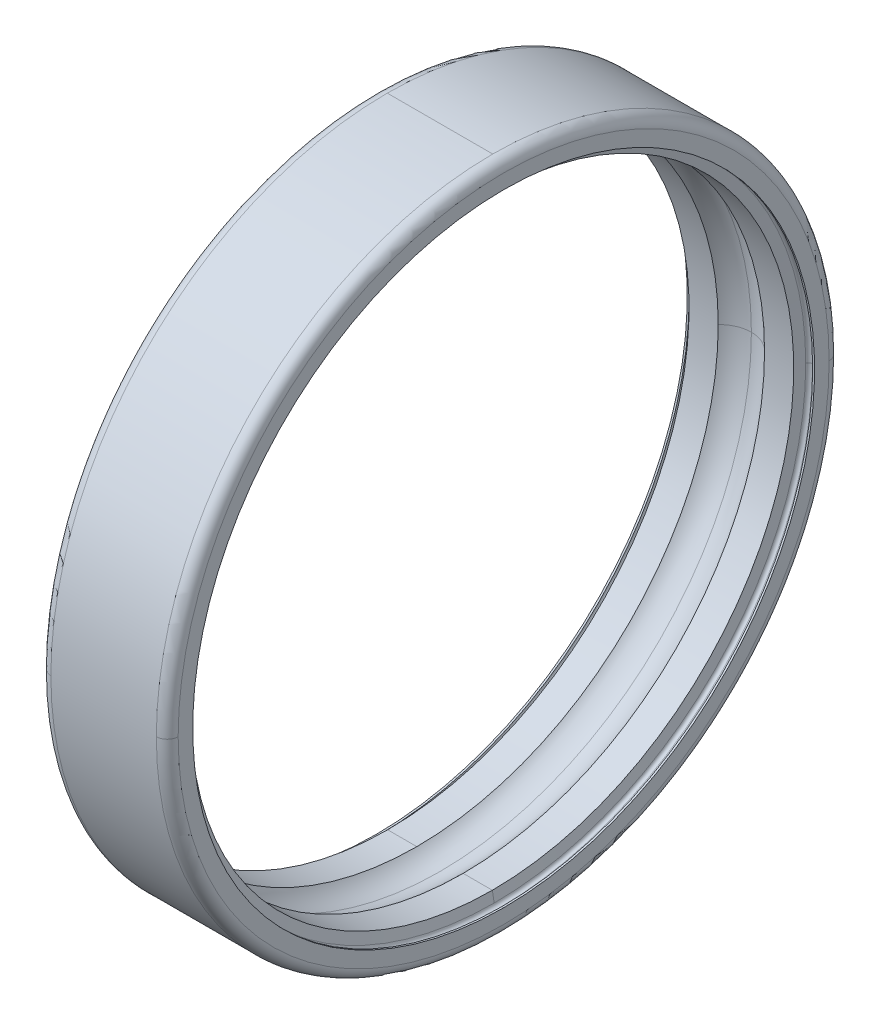
ISO-10303-21;
HEADER;
FILE_DESCRIPTION(('STEP AP214'),'2;1');
FILE_NAME('part.step','',(''),(''),'','','');
FILE_SCHEMA(('AUTOMOTIVE_DESIGN { 1 0 10303 214 1 1 1 1 }'));
ENDSEC;
DATA;
#1=APPLICATION_CONTEXT('core data for automotive mechanical design processes');
#2=APPLICATION_PROTOCOL_DEFINITION('international standard','automotive_design',2000,#1);
#3=PRODUCT_CONTEXT('',#1,'mechanical');
#4=PRODUCT('Part','Part','',(#3));
#5=PRODUCT_RELATED_PRODUCT_CATEGORY('part','',(#4));
#6=PRODUCT_DEFINITION_FORMATION('','',#4);
#7=PRODUCT_DEFINITION_CONTEXT('part definition',#1,'design');
#8=PRODUCT_DEFINITION('design','',#6,#7);
#9=PRODUCT_DEFINITION_SHAPE('','',#8);
#10=(LENGTH_UNIT() NAMED_UNIT(*) SI_UNIT(.MILLI.,.METRE.));
#11=(NAMED_UNIT(*) PLANE_ANGLE_UNIT() SI_UNIT($,.RADIAN.));
#12=(NAMED_UNIT(*) SI_UNIT($,.STERADIAN.) SOLID_ANGLE_UNIT());
#13=UNCERTAINTY_MEASURE_WITH_UNIT(LENGTH_MEASURE(1.E-05),#10,'distance_accuracy_value','');
#14=(GEOMETRIC_REPRESENTATION_CONTEXT(3) GLOBAL_UNCERTAINTY_ASSIGNED_CONTEXT((#13)) GLOBAL_UNIT_ASSIGNED_CONTEXT((#10,
#11,#12)) REPRESENTATION_CONTEXT('',''));
#15=CARTESIAN_POINT('',(0.,0.,0.));
#16=DIRECTION('',(0.,0.,1.));
#17=DIRECTION('',(1.,0.,0.));
#18=AXIS2_PLACEMENT_3D('',#15,#16,#17);
#19=CARTESIAN_POINT('',(6.685,0.,0.));
#20=DIRECTION('',(1.,0.,0.));
#21=DIRECTION('',(0.,0.,-1.));
#22=AXIS2_PLACEMENT_3D('',#19,#20,#21);
#23=TOROIDAL_SURFACE('',#22,17.1,0.21);
#24=CARTESIAN_POINT('',(6.685,0.,0.));
#25=DIRECTION('',(1.,0.,0.));
#26=DIRECTION('',(0.,0.,1.));
#27=AXIS2_PLACEMENT_3D('',#24,#25,#26);
#28=CIRCLE('',#27,17.31);
#29=CARTESIAN_POINT('',(6.685,0.,-17.31));
#30=VERTEX_POINT('',#29);
#31=CARTESIAN_POINT('',(6.685,0.,17.31));
#32=VERTEX_POINT('',#31);
#33=EDGE_CURVE('E186',#30,#32,#28,.T.);
#34=ORIENTED_EDGE('',*,*,#33,.T.);
#35=CARTESIAN_POINT('',(6.685,0.,17.1));
#36=DIRECTION('',(0.,-1.,0.));
#37=DIRECTION('',(0.,0.,1.));
#38=AXIS2_PLACEMENT_3D('',#35,#36,#37);
#39=CIRCLE('',#38,0.21);
#40=CARTESIAN_POINT('',(6.47819037186743,0.,17.1364661173101));
#41=VERTEX_POINT('',#40);
#42=EDGE_CURVE('E199',#32,#41,#39,.T.);
#43=ORIENTED_EDGE('',*,*,#42,.T.);
#44=CARTESIAN_POINT('',(6.47819037186743,0.,0.));
#45=DIRECTION('',(1.,0.,0.));
#46=DIRECTION('',(0.,1.,0.));
#47=AXIS2_PLACEMENT_3D('',#44,#45,#46);
#48=CIRCLE('',#47,17.1364661173101);
#49=CARTESIAN_POINT('',(6.47819037186743,17.1364661173101,0.));
#50=VERTEX_POINT('',#49);
#51=EDGE_CURVE('E33',#50,#41,#48,.T.);
#52=ORIENTED_EDGE('',*,*,#51,.F.);
#53=CARTESIAN_POINT('',(6.47819037186743,0.,0.));
#54=DIRECTION('',(1.,0.,0.));
#55=DIRECTION('',(0.,1.,0.));
#56=AXIS2_PLACEMENT_3D('',#53,#54,#55);
#57=CIRCLE('',#56,17.1364661173101);
#58=CARTESIAN_POINT('',(6.47819037186743,0.,-17.1364661173101));
#59=VERTEX_POINT('',#58);
#60=EDGE_CURVE('E187',#59,#50,#57,.T.);
#61=ORIENTED_EDGE('',*,*,#60,.F.);
#62=CARTESIAN_POINT('',(6.685,0.,-17.1));
#63=DIRECTION('',(0.,-1.,0.));
#64=DIRECTION('',(0.,0.,-1.));
#65=AXIS2_PLACEMENT_3D('',#62,#63,#64);
#66=CIRCLE('',#65,0.21);
#67=EDGE_CURVE('E183',#59,#30,#66,.T.);
#68=ORIENTED_EDGE('',*,*,#67,.T.);
#69=EDGE_LOOP('',(#34,#43,#52,#61,#68));
#70=FACE_BOUND('',#69,.T.);
#71=ADVANCED_FACE('F17',(#70),#23,.F.);
#72=CARTESIAN_POINT('',(6.9475,0.,0.));
#73=DIRECTION('',(1.,0.,0.));
#74=DIRECTION('',(0.,1.,0.));
#75=AXIS2_PLACEMENT_3D('',#72,#73,#74);
#76=CYLINDRICAL_SURFACE('',#75,17.1);
#77=DIRECTION('',(1.,0.,0.));
#78=VECTOR('',#77,1.);
#79=CARTESIAN_POINT('',(6.9475,17.1,0.));
#80=LINE('',#79,#78);
#81=CARTESIAN_POINT('',(6.895,17.1,0.));
#82=VERTEX_POINT('',#81);
#83=CARTESIAN_POINT('',(7.,17.1,0.));
#84=VERTEX_POINT('',#83);
#85=EDGE_CURVE('E227',#82,#84,#80,.T.);
#86=ORIENTED_EDGE('',*,*,#85,.T.);
#87=CARTESIAN_POINT('',(7.,0.,0.));
#88=DIRECTION('',(1.,0.,0.));
#89=DIRECTION('',(0.,1.,0.));
#90=AXIS2_PLACEMENT_3D('',#87,#88,#89);
#91=CIRCLE('',#90,17.1);
#92=CARTESIAN_POINT('',(7.,-17.1,0.));
#93=VERTEX_POINT('',#92);
#94=EDGE_CURVE('E11',#84,#93,#91,.T.);
#95=ORIENTED_EDGE('',*,*,#94,.T.);
#96=DIRECTION('',(-1.,0.,0.));
#97=VECTOR('',#96,1.);
#98=CARTESIAN_POINT('',(6.9475,-17.1,0.));
#99=LINE('',#98,#97);
#100=CARTESIAN_POINT('',(6.895,-17.1,0.));
#101=VERTEX_POINT('',#100);
#102=EDGE_CURVE('E309',#93,#101,#99,.T.);
#103=ORIENTED_EDGE('',*,*,#102,.T.);
#104=CARTESIAN_POINT('',(6.895,0.,0.));
#105=DIRECTION('',(1.,0.,0.));
#106=DIRECTION('',(0.,1.,0.));
#107=AXIS2_PLACEMENT_3D('',#104,#105,#106);
#108=CIRCLE('',#107,17.1);
#109=CARTESIAN_POINT('',(6.895,0.,17.1));
#110=VERTEX_POINT('',#109);
#111=EDGE_CURVE('E203',#110,#101,#108,.T.);
#112=ORIENTED_EDGE('',*,*,#111,.F.);
#113=CARTESIAN_POINT('',(6.895,0.,0.));
#114=DIRECTION('',(1.,0.,0.));
#115=DIRECTION('',(0.,1.,0.));
#116=AXIS2_PLACEMENT_3D('',#113,#114,#115);
#117=CIRCLE('',#116,17.1);
#118=EDGE_CURVE('E233',#82,#110,#117,.T.);
#119=ORIENTED_EDGE('',*,*,#118,.F.);
#120=EDGE_LOOP('',(#86,#95,#103,#112,#119));
#121=FACE_BOUND('',#120,.T.);
#122=ADVANCED_FACE('F497',(#121),#76,.F.);
#123=CARTESIAN_POINT('',(7.,17.5,0.));
#124=DIRECTION('',(1.,0.,0.));
#125=DIRECTION('',(0.,1.,0.));
#126=AXIS2_PLACEMENT_3D('',#123,#124,#125);
#127=PLANE('',#126);
#128=ORIENTED_EDGE('',*,*,#94,.F.);
#129=CARTESIAN_POINT('',(7.,0.,0.));
#130=DIRECTION('',(1.,0.,0.));
#131=DIRECTION('',(0.,1.,0.));
#132=AXIS2_PLACEMENT_3D('',#129,#130,#131);
#133=CIRCLE('',#132,17.1);
#134=EDGE_CURVE('E314',#93,#84,#133,.T.);
#135=ORIENTED_EDGE('',*,*,#134,.F.);
#136=EDGE_LOOP('',(#128,#135));
#137=FACE_BOUND('',#136,.T.);
#138=CARTESIAN_POINT('',(7.,0.,0.));
#139=DIRECTION('',(1.,0.,0.));
#140=DIRECTION('',(0.,1.,0.));
#141=AXIS2_PLACEMENT_3D('',#138,#139,#140);
#142=CIRCLE('',#141,17.9);
#143=CARTESIAN_POINT('',(7.,0.,17.9));
#144=VERTEX_POINT('',#143);
#145=CARTESIAN_POINT('',(7.,0.,-17.9));
#146=VERTEX_POINT('',#145);
#147=EDGE_CURVE('E25',#144,#146,#142,.T.);
#148=ORIENTED_EDGE('',*,*,#147,.T.);
#149=CARTESIAN_POINT('',(7.,0.,0.));
#150=DIRECTION('',(1.,0.,0.));
#151=DIRECTION('',(0.,1.,0.));
#152=AXIS2_PLACEMENT_3D('',#149,#150,#151);
#153=CIRCLE('',#152,17.9);
#154=EDGE_CURVE('E329',#146,#144,#153,.T.);
#155=ORIENTED_EDGE('',*,*,#154,.T.);
#156=EDGE_LOOP('',(#148,#155));
#157=FACE_BOUND('',#156,.T.);
#158=ADVANCED_FACE('F495',(#137,#157),#127,.T.);
#159=CARTESIAN_POINT('',(6.4,0.,0.));
#160=DIRECTION('',(1.,0.,0.));
#161=DIRECTION('',(0.,0.,-1.));
#162=AXIS2_PLACEMENT_3D('',#159,#160,#161);
#163=TOROIDAL_SURFACE('',#162,17.9,0.6);
#164=CARTESIAN_POINT('',(6.4,0.,-17.9));
#165=DIRECTION('',(0.,-1.,0.));
#166=DIRECTION('',(0.,0.,-1.));
#167=AXIS2_PLACEMENT_3D('',#164,#165,#166);
#168=CIRCLE('',#167,0.6);
#169=CARTESIAN_POINT('',(6.4,0.,-18.5));
#170=VERTEX_POINT('',#169);
#171=EDGE_CURVE('E317',#170,#146,#168,.T.);
#172=ORIENTED_EDGE('',*,*,#171,.T.);
#173=ORIENTED_EDGE('',*,*,#147,.F.);
#174=CARTESIAN_POINT('',(6.4,0.,17.9));
#175=DIRECTION('',(0.,-1.,0.));
#176=DIRECTION('',(0.,0.,1.));
#177=AXIS2_PLACEMENT_3D('',#174,#175,#176);
#178=CIRCLE('',#177,0.6);
#179=CARTESIAN_POINT('',(6.4,0.,18.5));
#180=VERTEX_POINT('',#179);
#181=EDGE_CURVE('E326',#144,#180,#178,.T.);
#182=ORIENTED_EDGE('',*,*,#181,.T.);
#183=CARTESIAN_POINT('',(6.4,0.,0.));
#184=DIRECTION('',(1.,0.,0.));
#185=DIRECTION('',(0.,1.,0.));
#186=AXIS2_PLACEMENT_3D('',#183,#184,#185);
#187=CIRCLE('',#186,18.5);
#188=CARTESIAN_POINT('',(6.4,-18.5,0.));
#189=VERTEX_POINT('',#188);
#190=EDGE_CURVE('E238',#180,#189,#187,.T.);
#191=ORIENTED_EDGE('',*,*,#190,.T.);
#192=CARTESIAN_POINT('',(6.4,0.,0.));
#193=DIRECTION('',(1.,0.,0.));
#194=DIRECTION('',(0.,1.,0.));
#195=AXIS2_PLACEMENT_3D('',#192,#193,#194);
#196=CIRCLE('',#195,18.5);
#197=EDGE_CURVE('E260',#189,#170,#196,.T.);
#198=ORIENTED_EDGE('',*,*,#197,.T.);
#199=EDGE_LOOP('',(#172,#173,#182,#191,#198));
#200=FACE_BOUND('',#199,.T.);
#201=ADVANCED_FACE('F490',(#200),#163,.T.);
#202=CARTESIAN_POINT('',(3.5,0.,0.));
#203=DIRECTION('',(1.,0.,0.));
#204=DIRECTION('',(0.,1.,0.));
#205=AXIS2_PLACEMENT_3D('',#202,#203,#204);
#206=CYLINDRICAL_SURFACE('',#205,18.5);
#207=DIRECTION('',(1.,0.,0.));
#208=VECTOR('',#207,1.);
#209=CARTESIAN_POINT('',(3.5,18.5,0.));
#210=LINE('',#209,#208);
#211=CARTESIAN_POINT('',(0.6,18.5,0.));
#212=VERTEX_POINT('',#211);
#213=CARTESIAN_POINT('',(6.4,18.5,0.));
#214=VERTEX_POINT('',#213);
#215=EDGE_CURVE('E332',#212,#214,#210,.T.);
#216=ORIENTED_EDGE('',*,*,#215,.T.);
#217=CARTESIAN_POINT('',(6.4,0.,0.));
#218=DIRECTION('',(1.,0.,0.));
#219=DIRECTION('',(0.,1.,0.));
#220=AXIS2_PLACEMENT_3D('',#217,#218,#219);
#221=CIRCLE('',#220,18.5);
#222=EDGE_CURVE('E320',#170,#214,#221,.T.);
#223=ORIENTED_EDGE('',*,*,#222,.F.);
#224=ORIENTED_EDGE('',*,*,#197,.F.);
#225=DIRECTION('',(-1.,0.,0.));
#226=VECTOR('',#225,1.);
#227=CARTESIAN_POINT('',(3.5,-18.5,0.));
#228=LINE('',#227,#226);
#229=CARTESIAN_POINT('',(0.6,-18.5,0.));
#230=VERTEX_POINT('',#229);
#231=EDGE_CURVE('E242',#189,#230,#228,.T.);
#232=ORIENTED_EDGE('',*,*,#231,.T.);
#233=CARTESIAN_POINT('',(0.6,0.,0.));
#234=DIRECTION('',(1.,0.,0.));
#235=DIRECTION('',(0.,1.,0.));
#236=AXIS2_PLACEMENT_3D('',#233,#234,#235);
#237=CIRCLE('',#236,18.5);
#238=CARTESIAN_POINT('',(0.6,0.,-18.5));
#239=VERTEX_POINT('',#238);
#240=EDGE_CURVE('E20',#230,#239,#237,.T.);
#241=ORIENTED_EDGE('',*,*,#240,.T.);
#242=CARTESIAN_POINT('',(0.6,0.,0.));
#243=DIRECTION('',(1.,0.,0.));
#244=DIRECTION('',(0.,1.,0.));
#245=AXIS2_PLACEMENT_3D('',#242,#243,#244);
#246=CIRCLE('',#245,18.5);
#247=EDGE_CURVE('E355',#239,#212,#246,.T.);
#248=ORIENTED_EDGE('',*,*,#247,.T.);
#249=EDGE_LOOP('',(#216,#223,#224,#232,#241,#248));
#250=FACE_BOUND('',#249,.T.);
#251=ADVANCED_FACE('F485',(#250),#206,.T.);
#252=CARTESIAN_POINT('',(0.6,0.,0.));
#253=DIRECTION('',(1.,0.,0.));
#254=DIRECTION('',(0.,0.,-1.));
#255=AXIS2_PLACEMENT_3D('',#252,#253,#254);
#256=TOROIDAL_SURFACE('',#255,17.9,0.6);
#257=CARTESIAN_POINT('',(0.6,0.,-17.9));
#258=DIRECTION('',(0.,-1.,0.));
#259=DIRECTION('',(0.,0.,-1.));
#260=AXIS2_PLACEMENT_3D('',#257,#258,#259);
#261=CIRCLE('',#260,0.6);
#262=CARTESIAN_POINT('',(0.,0.,-17.9));
#263=VERTEX_POINT('',#262);
#264=EDGE_CURVE('E241',#263,#239,#261,.T.);
#265=ORIENTED_EDGE('',*,*,#264,.T.);
#266=ORIENTED_EDGE('',*,*,#240,.F.);
#267=CARTESIAN_POINT('',(0.6,0.,0.));
#268=DIRECTION('',(1.,0.,0.));
#269=DIRECTION('',(0.,1.,0.));
#270=AXIS2_PLACEMENT_3D('',#267,#268,#269);
#271=CIRCLE('',#270,18.5);
#272=CARTESIAN_POINT('',(0.6,0.,18.5));
#273=VERTEX_POINT('',#272);
#274=EDGE_CURVE('E336',#273,#230,#271,.T.);
#275=ORIENTED_EDGE('',*,*,#274,.F.);
#276=CARTESIAN_POINT('',(0.6,0.,17.9));
#277=DIRECTION('',(0.,-1.,0.));
#278=DIRECTION('',(0.,0.,1.));
#279=AXIS2_PLACEMENT_3D('',#276,#277,#278);
#280=CIRCLE('',#279,0.6);
#281=CARTESIAN_POINT('',(0.,0.,17.9));
#282=VERTEX_POINT('',#281);
#283=EDGE_CURVE('E352',#273,#282,#280,.T.);
#284=ORIENTED_EDGE('',*,*,#283,.T.);
#285=CARTESIAN_POINT('',(0.,0.,0.));
#286=DIRECTION('',(1.,0.,0.));
#287=DIRECTION('',(0.,1.,0.));
#288=AXIS2_PLACEMENT_3D('',#285,#286,#287);
#289=CIRCLE('',#288,17.9);
#290=EDGE_CURVE('E361',#282,#263,#289,.T.);
#291=ORIENTED_EDGE('',*,*,#290,.T.);
#292=EDGE_LOOP('',(#265,#266,#275,#284,#291));
#293=FACE_BOUND('',#292,.T.);
#294=ADVANCED_FACE('F469',(#293),#256,.T.);
#295=CARTESIAN_POINT('',(0.,17.5,0.));
#296=DIRECTION('',(-1.,0.,0.));
#297=DIRECTION('',(0.,0.,1.));
#298=AXIS2_PLACEMENT_3D('',#295,#296,#297);
#299=PLANE('',#298);
#300=CARTESIAN_POINT('',(0.,0.,0.));
#301=DIRECTION('',(1.,0.,0.));
#302=DIRECTION('',(0.,1.,0.));
#303=AXIS2_PLACEMENT_3D('',#300,#301,#302);
#304=CIRCLE('',#303,17.1);
#305=CARTESIAN_POINT('',(0.,17.1,0.));
#306=VERTEX_POINT('',#305);
#307=CARTESIAN_POINT('',(0.,-17.1,0.));
#308=VERTEX_POINT('',#307);
#309=EDGE_CURVE('E357',#306,#308,#304,.T.);
#310=ORIENTED_EDGE('',*,*,#309,.T.);
#311=CARTESIAN_POINT('',(0.,0.,0.));
#312=DIRECTION('',(1.,0.,0.));
#313=DIRECTION('',(0.,1.,0.));
#314=AXIS2_PLACEMENT_3D('',#311,#312,#313);
#315=CIRCLE('',#314,17.1);
#316=EDGE_CURVE('E276',#308,#306,#315,.T.);
#317=ORIENTED_EDGE('',*,*,#316,.T.);
#318=EDGE_LOOP('',(#310,#317));
#319=FACE_BOUND('',#318,.T.);
#320=CARTESIAN_POINT('',(0.,0.,0.));
#321=DIRECTION('',(1.,0.,0.));
#322=DIRECTION('',(0.,1.,0.));
#323=AXIS2_PLACEMENT_3D('',#320,#321,#322);
#324=CIRCLE('',#323,17.9);
#325=EDGE_CURVE('E347',#263,#282,#324,.T.);
#326=ORIENTED_EDGE('',*,*,#325,.F.);
#327=ORIENTED_EDGE('',*,*,#290,.F.);
#328=EDGE_LOOP('',(#326,#327));
#329=FACE_BOUND('',#328,.T.);
#330=ADVANCED_FACE('F466',(#319,#329),#299,.T.);
#331=CARTESIAN_POINT('',(0.0525,0.,0.));
#332=DIRECTION('',(1.,0.,0.));
#333=DIRECTION('',(0.,1.,0.));
#334=AXIS2_PLACEMENT_3D('',#331,#332,#333);
#335=CYLINDRICAL_SURFACE('',#334,17.1);
#336=DIRECTION('',(1.,0.,0.));
#337=VECTOR('',#336,1.);
#338=CARTESIAN_POINT('',(0.0525,17.1,0.));
#339=LINE('',#338,#337);
#340=CARTESIAN_POINT('',(0.105,17.1,0.));
#341=VERTEX_POINT('',#340);
#342=EDGE_CURVE('E359',#306,#341,#339,.T.);
#343=ORIENTED_EDGE('',*,*,#342,.T.);
#344=CARTESIAN_POINT('',(0.105,0.,0.));
#345=DIRECTION('',(1.,0.,0.));
#346=DIRECTION('',(0.,1.,0.));
#347=AXIS2_PLACEMENT_3D('',#344,#345,#346);
#348=CIRCLE('',#347,17.1);
#349=CARTESIAN_POINT('',(0.105,0.,17.1));
#350=VERTEX_POINT('',#349);
#351=EDGE_CURVE('E349',#341,#350,#348,.T.);
#352=ORIENTED_EDGE('',*,*,#351,.T.);
#353=CARTESIAN_POINT('',(0.105,0.,0.));
#354=DIRECTION('',(1.,0.,0.));
#355=DIRECTION('',(0.,1.,0.));
#356=AXIS2_PLACEMENT_3D('',#353,#354,#355);
#357=CIRCLE('',#356,17.1);
#358=CARTESIAN_POINT('',(0.105,-17.1,0.));
#359=VERTEX_POINT('',#358);
#360=EDGE_CURVE('E252',#350,#359,#357,.T.);
#361=ORIENTED_EDGE('',*,*,#360,.T.);
#362=DIRECTION('',(-1.,0.,0.));
#363=VECTOR('',#362,1.);
#364=CARTESIAN_POINT('',(0.0525,-17.1,0.));
#365=LINE('',#364,#363);
#366=EDGE_CURVE('E272',#359,#308,#365,.T.);
#367=ORIENTED_EDGE('',*,*,#366,.T.);
#368=ORIENTED_EDGE('',*,*,#309,.F.);
#369=EDGE_LOOP('',(#343,#352,#361,#367,#368));
#370=FACE_BOUND('',#369,.T.);
#371=ADVANCED_FACE('F460',(#370),#335,.F.);
#372=CARTESIAN_POINT('',(0.315,0.,0.));
#373=DIRECTION('',(1.,0.,0.));
#374=DIRECTION('',(0.,0.,-1.));
#375=AXIS2_PLACEMENT_3D('',#372,#373,#374);
#376=TOROIDAL_SURFACE('',#375,17.1,0.21);
#377=CARTESIAN_POINT('',(0.315,0.,0.));
#378=DIRECTION('',(1.,0.,0.));
#379=DIRECTION('',(0.,0.,1.));
#380=AXIS2_PLACEMENT_3D('',#377,#378,#379);
#381=CIRCLE('',#380,17.31);
#382=CARTESIAN_POINT('',(0.315,0.,-17.31));
#383=VERTEX_POINT('',#382);
#384=CARTESIAN_POINT('',(0.315,0.,17.31));
#385=VERTEX_POINT('',#384);
#386=EDGE_CURVE('E247',#383,#385,#381,.T.);
#387=ORIENTED_EDGE('',*,*,#386,.T.);
#388=CARTESIAN_POINT('',(0.315,0.,17.1));
#389=DIRECTION('',(0.,-1.,0.));
#390=DIRECTION('',(0.,0.,1.));
#391=AXIS2_PLACEMENT_3D('',#388,#389,#390);
#392=CIRCLE('',#391,0.21);
#393=EDGE_CURVE('E248',#385,#350,#392,.T.);
#394=ORIENTED_EDGE('',*,*,#393,.T.);
#395=ORIENTED_EDGE('',*,*,#351,.F.);
#396=CARTESIAN_POINT('',(0.105,0.,0.));
#397=DIRECTION('',(1.,0.,0.));
#398=DIRECTION('',(0.,1.,0.));
#399=AXIS2_PLACEMENT_3D('',#396,#397,#398);
#400=CIRCLE('',#399,17.1);
#401=CARTESIAN_POINT('',(0.105,0.,-17.1));
#402=VERTEX_POINT('',#401);
#403=EDGE_CURVE('E369',#402,#341,#400,.T.);
#404=ORIENTED_EDGE('',*,*,#403,.F.);
#405=CARTESIAN_POINT('',(0.315,0.,-17.1));
#406=DIRECTION('',(0.,-1.,0.));
#407=DIRECTION('',(0.,0.,-1.));
#408=AXIS2_PLACEMENT_3D('',#405,#406,#407);
#409=CIRCLE('',#408,0.21);
#410=EDGE_CURVE('E372',#402,#383,#409,.T.);
#411=ORIENTED_EDGE('',*,*,#410,.T.);
#412=EDGE_LOOP('',(#387,#394,#395,#404,#411));
#413=FACE_BOUND('',#412,.T.);
#414=ADVANCED_FACE('F452',(#413),#376,.F.);
#415=CARTESIAN_POINT('',(0.57131044075026,0.,0.));
#416=DIRECTION('',(-1.,0.,0.));
#417=DIRECTION('',(0.,1.,0.));
#418=AXIS2_PLACEMENT_3D('',#415,#416,#417);
#419=CONICAL_SURFACE('',#418,16.855733058655,1.39626340159546);
#420=DIRECTION('',(0.17364817766693,-0.984807753012208,0.));
#421=VECTOR('',#420,1.);
#422=CARTESIAN_POINT('',(0.57131044075026,16.855733058655,0.));
#423=LINE('',#422,#421);
#424=CARTESIAN_POINT('',(0.521809628132566,17.1364661173101,0.));
#425=VERTEX_POINT('',#424);
#426=CARTESIAN_POINT('',(0.620811253367953,16.575,0.));
#427=VERTEX_POINT('',#426);
#428=EDGE_CURVE('E251',#425,#427,#423,.T.);
#429=ORIENTED_EDGE('',*,*,#428,.T.);
#430=CARTESIAN_POINT('',(0.620811253367953,0.,0.));
#431=DIRECTION('',(1.,0.,0.));
#432=DIRECTION('',(0.,1.,0.));
#433=AXIS2_PLACEMENT_3D('',#430,#431,#432);
#434=CIRCLE('',#433,16.575);
#435=CARTESIAN_POINT('',(0.620811253367953,-16.575,0.));
#436=VERTEX_POINT('',#435);
#437=EDGE_CURVE('E344',#427,#436,#434,.T.);
#438=ORIENTED_EDGE('',*,*,#437,.T.);
#439=DIRECTION('',(-0.17364817766693,-0.984807753012208,0.));
#440=VECTOR('',#439,1.);
#441=CARTESIAN_POINT('',(0.57131044075026,-16.855733058655,0.));
#442=LINE('',#441,#440);
#443=CARTESIAN_POINT('',(0.521809628132566,-17.1364661173101,0.));
#444=VERTEX_POINT('',#443);
#445=EDGE_CURVE('E293',#436,#444,#442,.T.);
#446=ORIENTED_EDGE('',*,*,#445,.T.);
#447=CARTESIAN_POINT('',(0.521809628132566,0.,0.));
#448=DIRECTION('',(1.,0.,0.));
#449=DIRECTION('',(0.,1.,0.));
#450=AXIS2_PLACEMENT_3D('',#447,#448,#449);
#451=CIRCLE('',#450,17.1364661173101);
#452=CARTESIAN_POINT('',(0.521809628132566,0.,17.1364661173101));
#453=VERTEX_POINT('',#452);
#454=EDGE_CURVE('E288',#453,#444,#451,.T.);
#455=ORIENTED_EDGE('',*,*,#454,.F.);
#456=CARTESIAN_POINT('',(0.521809628132566,0.,0.));
#457=DIRECTION('',(1.,0.,0.));
#458=DIRECTION('',(0.,1.,0.));
#459=AXIS2_PLACEMENT_3D('',#456,#457,#458);
#460=CIRCLE('',#459,17.1364661173101);
#461=EDGE_CURVE('E264',#425,#453,#460,.T.);
#462=ORIENTED_EDGE('',*,*,#461,.F.);
#463=EDGE_LOOP('',(#429,#438,#446,#455,#462));
#464=FACE_BOUND('',#463,.T.);
#465=ADVANCED_FACE('F441',(#464),#419,.F.);
#466=CARTESIAN_POINT('',(1.42351866654113,0.,0.));
#467=DIRECTION('',(1.,0.,0.));
#468=DIRECTION('',(0.,1.,0.));
#469=AXIS2_PLACEMENT_3D('',#466,#467,#468);
#470=CYLINDRICAL_SURFACE('',#469,16.575);
#471=DIRECTION('',(1.,0.,0.));
#472=VECTOR('',#471,1.);
#473=CARTESIAN_POINT('',(1.42351866654113,16.575,0.));
#474=LINE('',#473,#472);
#475=CARTESIAN_POINT('',(2.2262260797143,16.575,0.));
#476=VERTEX_POINT('',#475);
#477=EDGE_CURVE('E298',#427,#476,#474,.T.);
#478=ORIENTED_EDGE('',*,*,#477,.T.);
#479=CARTESIAN_POINT('',(2.2262260797143,0.,0.));
#480=DIRECTION('',(1.,0.,0.));
#481=DIRECTION('',(0.,1.,0.));
#482=AXIS2_PLACEMENT_3D('',#479,#480,#481);
#483=CIRCLE('',#482,16.575);
#484=CARTESIAN_POINT('',(2.2262260797143,0.,16.575));
#485=VERTEX_POINT('',#484);
#486=EDGE_CURVE('E342',#476,#485,#483,.T.);
#487=ORIENTED_EDGE('',*,*,#486,.T.);
#488=CARTESIAN_POINT('',(2.2262260797143,0.,0.));
#489=DIRECTION('',(1.,0.,0.));
#490=DIRECTION('',(0.,1.,0.));
#491=AXIS2_PLACEMENT_3D('',#488,#489,#490);
#492=CIRCLE('',#491,16.575);
#493=CARTESIAN_POINT('',(2.2262260797143,-16.575,0.));
#494=VERTEX_POINT('',#493);
#495=EDGE_CURVE('E382',#485,#494,#492,.T.);
#496=ORIENTED_EDGE('',*,*,#495,.T.);
#497=DIRECTION('',(-1.,0.,0.));
#498=VECTOR('',#497,1.);
#499=CARTESIAN_POINT('',(1.42351866654113,-16.575,0.));
#500=LINE('',#499,#498);
#501=EDGE_CURVE('E306',#494,#436,#500,.T.);
#502=ORIENTED_EDGE('',*,*,#501,.T.);
#503=ORIENTED_EDGE('',*,*,#437,.F.);
#504=EDGE_LOOP('',(#478,#487,#496,#502,#503));
#505=FACE_BOUND('',#504,.T.);
#506=ADVANCED_FACE('F430',(#505),#470,.F.);
#507=CARTESIAN_POINT('',(3.5,0.,0.));
#508=DIRECTION('',(1.,0.,0.));
#509=DIRECTION('',(0.,0.,-1.));
#510=AXIS2_PLACEMENT_3D('',#507,#508,#509);
#511=TOROIDAL_SURFACE('',#510,15.375,1.75);
#512=CARTESIAN_POINT('',(3.5,0.,0.));
#513=DIRECTION('',(1.,0.,0.));
#514=DIRECTION('',(0.,0.,1.));
#515=AXIS2_PLACEMENT_3D('',#512,#513,#514);
#516=CIRCLE('',#515,17.125);
#517=CARTESIAN_POINT('',(3.5,0.,-17.125));
#518=VERTEX_POINT('',#517);
#519=CARTESIAN_POINT('',(3.5,0.,17.125));
#520=VERTEX_POINT('',#519);
#521=EDGE_CURVE('E245',#518,#520,#516,.T.);
#522=ORIENTED_EDGE('',*,*,#521,.T.);
#523=CARTESIAN_POINT('',(3.5,0.,15.375));
#524=DIRECTION('',(0.,-1.,0.));
#525=DIRECTION('',(0.,0.,1.));
#526=AXIS2_PLACEMENT_3D('',#523,#524,#525);
#527=CIRCLE('',#526,1.75);
#528=EDGE_CURVE('E384',#520,#485,#527,.T.);
#529=ORIENTED_EDGE('',*,*,#528,.T.);
#530=ORIENTED_EDGE('',*,*,#486,.F.);
#531=CARTESIAN_POINT('',(2.2262260797143,0.,0.));
#532=DIRECTION('',(1.,0.,0.));
#533=DIRECTION('',(0.,1.,0.));
#534=AXIS2_PLACEMENT_3D('',#531,#532,#533);
#535=CIRCLE('',#534,16.575);
#536=CARTESIAN_POINT('',(2.2262260797143,0.,-16.575));
#537=VERTEX_POINT('',#536);
#538=EDGE_CURVE('E305',#537,#476,#535,.T.);
#539=ORIENTED_EDGE('',*,*,#538,.F.);
#540=CARTESIAN_POINT('',(3.5,0.,-15.375));
#541=DIRECTION('',(0.,-1.,0.));
#542=DIRECTION('',(0.,0.,-1.));
#543=AXIS2_PLACEMENT_3D('',#540,#541,#542);
#544=CIRCLE('',#543,1.75);
#545=EDGE_CURVE('E312',#537,#518,#544,.T.);
#546=ORIENTED_EDGE('',*,*,#545,.T.);
#547=EDGE_LOOP('',(#522,#529,#530,#539,#546));
#548=FACE_BOUND('',#547,.T.);
#549=ADVANCED_FACE('F422',(#548),#511,.F.);
#550=CARTESIAN_POINT('',(5.57648133345887,0.,0.));
#551=DIRECTION('',(1.,0.,0.));
#552=DIRECTION('',(0.,1.,0.));
#553=AXIS2_PLACEMENT_3D('',#550,#551,#552);
#554=CYLINDRICAL_SURFACE('',#553,16.575);
#555=DIRECTION('',(1.,0.,0.));
#556=VECTOR('',#555,1.);
#557=CARTESIAN_POINT('',(5.57648133345887,16.575,0.));
#558=LINE('',#557,#556);
#559=CARTESIAN_POINT('',(4.7737739202857,16.575,0.));
#560=VERTEX_POINT('',#559);
#561=CARTESIAN_POINT('',(6.37918874663205,16.575,0.));
#562=VERTEX_POINT('',#561);
#563=EDGE_CURVE('E387',#560,#562,#558,.T.);
#564=ORIENTED_EDGE('',*,*,#563,.T.);
#565=CARTESIAN_POINT('',(6.37918874663205,0.,0.));
#566=DIRECTION('',(1.,0.,0.));
#567=DIRECTION('',(0.,1.,0.));
#568=AXIS2_PLACEMENT_3D('',#565,#566,#567);
#569=CIRCLE('',#568,16.575);
#570=CARTESIAN_POINT('',(6.37918874663205,-16.575,0.));
#571=VERTEX_POINT('',#570);
#572=EDGE_CURVE('E41',#562,#571,#569,.T.);
#573=ORIENTED_EDGE('',*,*,#572,.T.);
#574=DIRECTION('',(-1.,0.,0.));
#575=VECTOR('',#574,1.);
#576=CARTESIAN_POINT('',(5.57648133345887,-16.575,0.));
#577=LINE('',#576,#575);
#578=CARTESIAN_POINT('',(4.7737739202857,-16.575,0.));
#579=VERTEX_POINT('',#578);
#580=EDGE_CURVE('E389',#571,#579,#577,.T.);
#581=ORIENTED_EDGE('',*,*,#580,.T.);
#582=CARTESIAN_POINT('',(4.7737739202857,0.,0.));
#583=DIRECTION('',(1.,0.,0.));
#584=DIRECTION('',(0.,1.,0.));
#585=AXIS2_PLACEMENT_3D('',#582,#583,#584);
#586=CIRCLE('',#585,16.575);
#587=CARTESIAN_POINT('',(4.7737739202857,0.,16.575));
#588=VERTEX_POINT('',#587);
#589=EDGE_CURVE('E279',#588,#579,#586,.T.);
#590=ORIENTED_EDGE('',*,*,#589,.F.);
#591=CARTESIAN_POINT('',(4.7737739202857,0.,0.));
#592=DIRECTION('',(1.,0.,0.));
#593=DIRECTION('',(0.,1.,0.));
#594=AXIS2_PLACEMENT_3D('',#591,#592,#593);
#595=CIRCLE('',#594,16.575);
#596=EDGE_CURVE('E223',#560,#588,#595,.T.);
#597=ORIENTED_EDGE('',*,*,#596,.F.);
#598=EDGE_LOOP('',(#564,#573,#581,#590,#597));
#599=FACE_BOUND('',#598,.T.);
#600=ADVANCED_FACE('F412',(#599),#554,.F.);
#601=CARTESIAN_POINT('',(6.42868955924974,0.,0.));
#602=DIRECTION('',(1.,0.,0.));
#603=DIRECTION('',(0.,1.,0.));
#604=AXIS2_PLACEMENT_3D('',#601,#602,#603);
#605=CONICAL_SURFACE('',#604,16.855733058655,1.39626340159546);
#606=DIRECTION('',(0.173648177666933,0.984807753012208,0.));
#607=VECTOR('',#606,1.);
#608=CARTESIAN_POINT('',(6.42868955924974,16.855733058655,0.));
#609=LINE('',#608,#607);
#610=EDGE_CURVE('E394',#562,#50,#609,.T.);
#611=ORIENTED_EDGE('',*,*,#610,.T.);
#612=ORIENTED_EDGE('',*,*,#51,.T.);
#613=CARTESIAN_POINT('',(6.47819037186743,0.,0.));
#614=DIRECTION('',(1.,0.,0.));
#615=DIRECTION('',(0.,1.,0.));
#616=AXIS2_PLACEMENT_3D('',#613,#614,#615);
#617=CIRCLE('',#616,17.1364661173101);
#618=CARTESIAN_POINT('',(6.47819037186743,-17.1364661173101,0.));
#619=VERTEX_POINT('',#618);
#620=EDGE_CURVE('E228',#41,#619,#617,.T.);
#621=ORIENTED_EDGE('',*,*,#620,.T.);
#622=DIRECTION('',(-0.173648177666933,0.984807753012208,0.));
#623=VECTOR('',#622,1.);
#624=CARTESIAN_POINT('',(6.42868955924974,-16.855733058655,0.));
#625=LINE('',#624,#623);
#626=EDGE_CURVE('E397',#619,#571,#625,.T.);
#627=ORIENTED_EDGE('',*,*,#626,.T.);
#628=ORIENTED_EDGE('',*,*,#572,.F.);
#629=EDGE_LOOP('',(#611,#612,#621,#627,#628));
#630=FACE_BOUND('',#629,.T.);
#631=ADVANCED_FACE('F401',(#630),#605,.F.);
#632=CARTESIAN_POINT('',(6.42868955924974,0.,0.));
#633=DIRECTION('',(1.,0.,0.));
#634=DIRECTION('',(0.,1.,0.));
#635=AXIS2_PLACEMENT_3D('',#632,#633,#634);
#636=CONICAL_SURFACE('',#635,16.855733058655,1.39626340159546);
#637=ORIENTED_EDGE('',*,*,#610,.F.);
#638=CARTESIAN_POINT('',(6.37918874663205,0.,0.));
#639=DIRECTION('',(1.,0.,0.));
#640=DIRECTION('',(0.,1.,0.));
#641=AXIS2_PLACEMENT_3D('',#638,#639,#640);
#642=CIRCLE('',#641,16.575);
#643=EDGE_CURVE('E391',#571,#562,#642,.T.);
#644=ORIENTED_EDGE('',*,*,#643,.F.);
#645=ORIENTED_EDGE('',*,*,#626,.F.);
#646=CARTESIAN_POINT('',(6.47819037186743,0.,0.));
#647=DIRECTION('',(1.,0.,0.));
#648=DIRECTION('',(0.,1.,0.));
#649=AXIS2_PLACEMENT_3D('',#646,#647,#648);
#650=CIRCLE('',#649,17.1364661173101);
#651=EDGE_CURVE('E191',#619,#59,#650,.T.);
#652=ORIENTED_EDGE('',*,*,#651,.T.);
#653=ORIENTED_EDGE('',*,*,#60,.T.);
#654=EDGE_LOOP('',(#637,#644,#645,#652,#653));
#655=FACE_BOUND('',#654,.T.);
#656=ADVANCED_FACE('F404',(#655),#636,.F.);
#657=CARTESIAN_POINT('',(5.57648133345887,0.,0.));
#658=DIRECTION('',(1.,0.,0.));
#659=DIRECTION('',(0.,1.,0.));
#660=AXIS2_PLACEMENT_3D('',#657,#658,#659);
#661=CYLINDRICAL_SURFACE('',#660,16.575);
#662=ORIENTED_EDGE('',*,*,#563,.F.);
#663=CARTESIAN_POINT('',(4.7737739202857,0.,0.));
#664=DIRECTION('',(1.,0.,0.));
#665=DIRECTION('',(0.,1.,0.));
#666=AXIS2_PLACEMENT_3D('',#663,#664,#665);
#667=CIRCLE('',#666,16.575);
#668=CARTESIAN_POINT('',(4.7737739202857,0.,-16.575));
#669=VERTEX_POINT('',#668);
#670=EDGE_CURVE('E221',#669,#560,#667,.T.);
#671=ORIENTED_EDGE('',*,*,#670,.F.);
#672=CARTESIAN_POINT('',(4.7737739202857,0.,0.));
#673=DIRECTION('',(1.,0.,0.));
#674=DIRECTION('',(0.,1.,0.));
#675=AXIS2_PLACEMENT_3D('',#672,#673,#674);
#676=CIRCLE('',#675,16.575);
#677=EDGE_CURVE('E282',#579,#669,#676,.T.);
#678=ORIENTED_EDGE('',*,*,#677,.F.);
#679=ORIENTED_EDGE('',*,*,#580,.F.);
#680=ORIENTED_EDGE('',*,*,#643,.T.);
#681=EDGE_LOOP('',(#662,#671,#678,#679,#680));
#682=FACE_BOUND('',#681,.T.);
#683=ADVANCED_FACE('F408',(#682),#661,.F.);
#684=CARTESIAN_POINT('',(3.5,0.,0.));
#685=DIRECTION('',(1.,0.,0.));
#686=DIRECTION('',(0.,0.,-1.));
#687=AXIS2_PLACEMENT_3D('',#684,#685,#686);
#688=TOROIDAL_SURFACE('',#687,15.375,1.75);
#689=CARTESIAN_POINT('',(3.5,0.,0.));
#690=DIRECTION('',(1.,0.,0.));
#691=DIRECTION('',(0.,0.,1.));
#692=AXIS2_PLACEMENT_3D('',#689,#690,#691);
#693=CIRCLE('',#692,17.125);
#694=EDGE_CURVE('E236',#520,#518,#693,.T.);
#695=ORIENTED_EDGE('',*,*,#694,.T.);
#696=ORIENTED_EDGE('',*,*,#545,.F.);
#697=CARTESIAN_POINT('',(2.2262260797143,0.,0.));
#698=DIRECTION('',(1.,0.,0.));
#699=DIRECTION('',(0.,1.,0.));
#700=AXIS2_PLACEMENT_3D('',#697,#698,#699);
#701=CIRCLE('',#700,16.575);
#702=EDGE_CURVE('E302',#494,#537,#701,.T.);
#703=ORIENTED_EDGE('',*,*,#702,.F.);
#704=ORIENTED_EDGE('',*,*,#495,.F.);
#705=ORIENTED_EDGE('',*,*,#528,.F.);
#706=EDGE_LOOP('',(#695,#696,#703,#704,#705));
#707=FACE_BOUND('',#706,.T.);
#708=ADVANCED_FACE('F427',(#707),#688,.F.);
#709=CARTESIAN_POINT('',(1.42351866654113,0.,0.));
#710=DIRECTION('',(1.,0.,0.));
#711=DIRECTION('',(0.,1.,0.));
#712=AXIS2_PLACEMENT_3D('',#709,#710,#711);
#713=CYLINDRICAL_SURFACE('',#712,16.575);
#714=ORIENTED_EDGE('',*,*,#477,.F.);
#715=CARTESIAN_POINT('',(0.620811253367953,0.,0.));
#716=DIRECTION('',(1.,0.,0.));
#717=DIRECTION('',(0.,1.,0.));
#718=AXIS2_PLACEMENT_3D('',#715,#716,#717);
#719=CIRCLE('',#718,16.575);
#720=EDGE_CURVE('E294',#436,#427,#719,.T.);
#721=ORIENTED_EDGE('',*,*,#720,.F.);
#722=ORIENTED_EDGE('',*,*,#501,.F.);
#723=ORIENTED_EDGE('',*,*,#702,.T.);
#724=ORIENTED_EDGE('',*,*,#538,.T.);
#725=EDGE_LOOP('',(#714,#721,#722,#723,#724));
#726=FACE_BOUND('',#725,.T.);
#727=ADVANCED_FACE('F434',(#726),#713,.F.);
#728=CARTESIAN_POINT('',(0.57131044075026,0.,0.));
#729=DIRECTION('',(-1.,0.,0.));
#730=DIRECTION('',(0.,1.,0.));
#731=AXIS2_PLACEMENT_3D('',#728,#729,#730);
#732=CONICAL_SURFACE('',#731,16.855733058655,1.39626340159546);
#733=ORIENTED_EDGE('',*,*,#428,.F.);
#734=CARTESIAN_POINT('',(0.521809628132566,0.,0.));
#735=DIRECTION('',(1.,0.,0.));
#736=DIRECTION('',(0.,1.,0.));
#737=AXIS2_PLACEMENT_3D('',#734,#735,#736);
#738=CIRCLE('',#737,17.1364661173101);
#739=CARTESIAN_POINT('',(0.521809628132566,0.,-17.1364661173101));
#740=VERTEX_POINT('',#739);
#741=EDGE_CURVE('E259',#740,#425,#738,.T.);
#742=ORIENTED_EDGE('',*,*,#741,.F.);
#743=CARTESIAN_POINT('',(0.521809628132566,0.,0.));
#744=DIRECTION('',(1.,0.,0.));
#745=DIRECTION('',(0.,1.,0.));
#746=AXIS2_PLACEMENT_3D('',#743,#744,#745);
#747=CIRCLE('',#746,17.1364661173101);
#748=EDGE_CURVE('E204',#444,#740,#747,.T.);
#749=ORIENTED_EDGE('',*,*,#748,.F.);
#750=ORIENTED_EDGE('',*,*,#445,.F.);
#751=ORIENTED_EDGE('',*,*,#720,.T.);
#752=EDGE_LOOP('',(#733,#742,#749,#750,#751));
#753=FACE_BOUND('',#752,.T.);
#754=ADVANCED_FACE('F438',(#753),#732,.F.);
#755=CARTESIAN_POINT('',(0.315,0.,0.));
#756=DIRECTION('',(1.,0.,0.));
#757=DIRECTION('',(0.,0.,-1.));
#758=AXIS2_PLACEMENT_3D('',#755,#756,#757);
#759=TOROIDAL_SURFACE('',#758,17.1,0.21);
#760=CARTESIAN_POINT('',(0.315,0.,0.));
#761=DIRECTION('',(1.,0.,0.));
#762=DIRECTION('',(0.,0.,1.));
#763=AXIS2_PLACEMENT_3D('',#760,#761,#762);
#764=CIRCLE('',#763,17.31);
#765=EDGE_CURVE('E284',#385,#383,#764,.T.);
#766=ORIENTED_EDGE('',*,*,#765,.T.);
#767=ORIENTED_EDGE('',*,*,#410,.F.);
#768=CARTESIAN_POINT('',(0.105,0.,0.));
#769=DIRECTION('',(1.,0.,0.));
#770=DIRECTION('',(0.,1.,0.));
#771=AXIS2_PLACEMENT_3D('',#768,#769,#770);
#772=CIRCLE('',#771,17.1);
#773=EDGE_CURVE('E275',#359,#402,#772,.T.);
#774=ORIENTED_EDGE('',*,*,#773,.F.);
#775=ORIENTED_EDGE('',*,*,#360,.F.);
#776=ORIENTED_EDGE('',*,*,#393,.F.);
#777=EDGE_LOOP('',(#766,#767,#774,#775,#776));
#778=FACE_BOUND('',#777,.T.);
#779=ADVANCED_FACE('F457',(#778),#759,.F.);
#780=CARTESIAN_POINT('',(0.0525,0.,0.));
#781=DIRECTION('',(1.,0.,0.));
#782=DIRECTION('',(0.,1.,0.));
#783=AXIS2_PLACEMENT_3D('',#780,#781,#782);
#784=CYLINDRICAL_SURFACE('',#783,17.1);
#785=ORIENTED_EDGE('',*,*,#342,.F.);
#786=ORIENTED_EDGE('',*,*,#316,.F.);
#787=ORIENTED_EDGE('',*,*,#366,.F.);
#788=ORIENTED_EDGE('',*,*,#773,.T.);
#789=ORIENTED_EDGE('',*,*,#403,.T.);
#790=EDGE_LOOP('',(#785,#786,#787,#788,#789));
#791=FACE_BOUND('',#790,.T.);
#792=ADVANCED_FACE('F464',(#791),#784,.F.);
#793=CARTESIAN_POINT('',(0.6,0.,0.));
#794=DIRECTION('',(1.,0.,0.));
#795=DIRECTION('',(0.,0.,-1.));
#796=AXIS2_PLACEMENT_3D('',#793,#794,#795);
#797=TOROIDAL_SURFACE('',#796,17.9,0.6);
#798=ORIENTED_EDGE('',*,*,#264,.F.);
#799=ORIENTED_EDGE('',*,*,#325,.T.);
#800=ORIENTED_EDGE('',*,*,#283,.F.);
#801=CARTESIAN_POINT('',(0.6,0.,0.));
#802=DIRECTION('',(1.,0.,0.));
#803=DIRECTION('',(0.,1.,0.));
#804=AXIS2_PLACEMENT_3D('',#801,#802,#803);
#805=CIRCLE('',#804,18.5);
#806=EDGE_CURVE('E334',#212,#273,#805,.T.);
#807=ORIENTED_EDGE('',*,*,#806,.F.);
#808=ORIENTED_EDGE('',*,*,#247,.F.);
#809=EDGE_LOOP('',(#798,#799,#800,#807,#808));
#810=FACE_BOUND('',#809,.T.);
#811=ADVANCED_FACE('F475',(#810),#797,.T.);
#812=CARTESIAN_POINT('',(3.5,0.,0.));
#813=DIRECTION('',(1.,0.,0.));
#814=DIRECTION('',(0.,1.,0.));
#815=AXIS2_PLACEMENT_3D('',#812,#813,#814);
#816=CYLINDRICAL_SURFACE('',#815,18.5);
#817=ORIENTED_EDGE('',*,*,#215,.F.);
#818=ORIENTED_EDGE('',*,*,#806,.T.);
#819=ORIENTED_EDGE('',*,*,#274,.T.);
#820=ORIENTED_EDGE('',*,*,#231,.F.);
#821=ORIENTED_EDGE('',*,*,#190,.F.);
#822=CARTESIAN_POINT('',(6.4,0.,0.));
#823=DIRECTION('',(1.,0.,0.));
#824=DIRECTION('',(0.,1.,0.));
#825=AXIS2_PLACEMENT_3D('',#822,#823,#824);
#826=CIRCLE('',#825,18.5);
#827=EDGE_CURVE('E323',#214,#180,#826,.T.);
#828=ORIENTED_EDGE('',*,*,#827,.F.);
#829=EDGE_LOOP('',(#817,#818,#819,#820,#821,#828));
#830=FACE_BOUND('',#829,.T.);
#831=ADVANCED_FACE('F482',(#830),#816,.T.);
#832=CARTESIAN_POINT('',(6.4,0.,0.));
#833=DIRECTION('',(1.,0.,0.));
#834=DIRECTION('',(0.,0.,-1.));
#835=AXIS2_PLACEMENT_3D('',#832,#833,#834);
#836=TOROIDAL_SURFACE('',#835,17.9,0.6);
#837=ORIENTED_EDGE('',*,*,#171,.F.);
#838=ORIENTED_EDGE('',*,*,#222,.T.);
#839=ORIENTED_EDGE('',*,*,#827,.T.);
#840=ORIENTED_EDGE('',*,*,#181,.F.);
#841=ORIENTED_EDGE('',*,*,#154,.F.);
#842=EDGE_LOOP('',(#837,#838,#839,#840,#841));
#843=FACE_BOUND('',#842,.T.);
#844=ADVANCED_FACE('F493',(#843),#836,.T.);
#845=CARTESIAN_POINT('',(6.9475,0.,0.));
#846=DIRECTION('',(1.,0.,0.));
#847=DIRECTION('',(0.,1.,0.));
#848=AXIS2_PLACEMENT_3D('',#845,#846,#847);
#849=CYLINDRICAL_SURFACE('',#848,17.1);
#850=ORIENTED_EDGE('',*,*,#85,.F.);
#851=CARTESIAN_POINT('',(6.895,0.,0.));
#852=DIRECTION('',(1.,0.,0.));
#853=DIRECTION('',(0.,1.,0.));
#854=AXIS2_PLACEMENT_3D('',#851,#852,#853);
#855=CIRCLE('',#854,17.1);
#856=CARTESIAN_POINT('',(6.895,0.,-17.1));
#857=VERTEX_POINT('',#856);
#858=EDGE_CURVE('E214',#857,#82,#855,.T.);
#859=ORIENTED_EDGE('',*,*,#858,.F.);
#860=CARTESIAN_POINT('',(6.895,0.,0.));
#861=DIRECTION('',(1.,0.,0.));
#862=DIRECTION('',(0.,1.,0.));
#863=AXIS2_PLACEMENT_3D('',#860,#861,#862);
#864=CIRCLE('',#863,17.1);
#865=EDGE_CURVE('E192',#101,#857,#864,.T.);
#866=ORIENTED_EDGE('',*,*,#865,.F.);
#867=ORIENTED_EDGE('',*,*,#102,.F.);
#868=ORIENTED_EDGE('',*,*,#134,.T.);
#869=EDGE_LOOP('',(#850,#859,#866,#867,#868));
#870=FACE_BOUND('',#869,.T.);
#871=ADVANCED_FACE('F688',(#870),#849,.F.);
#872=CARTESIAN_POINT('',(6.685,0.,0.));
#873=DIRECTION('',(1.,0.,0.));
#874=DIRECTION('',(0.,0.,-1.));
#875=AXIS2_PLACEMENT_3D('',#872,#873,#874);
#876=TOROIDAL_SURFACE('',#875,17.1,0.21);
#877=CARTESIAN_POINT('',(6.685,0.,0.));
#878=DIRECTION('',(1.,0.,0.));
#879=DIRECTION('',(0.,0.,1.));
#880=AXIS2_PLACEMENT_3D('',#877,#878,#879);
#881=CIRCLE('',#880,17.31);
#882=EDGE_CURVE('E195',#32,#30,#881,.T.);
#883=ORIENTED_EDGE('',*,*,#882,.T.);
#884=ORIENTED_EDGE('',*,*,#67,.F.);
#885=ORIENTED_EDGE('',*,*,#651,.F.);
#886=ORIENTED_EDGE('',*,*,#620,.F.);
#887=ORIENTED_EDGE('',*,*,#42,.F.);
#888=EDGE_LOOP('',(#883,#884,#885,#886,#887));
#889=FACE_BOUND('',#888,.T.);
#890=ADVANCED_FACE('F197',(#889),#876,.F.);
#891=CARTESIAN_POINT('',(6.685,0.,0.));
#892=DIRECTION('',(1.,0.,0.));
#893=DIRECTION('',(0.,0.,-1.));
#894=AXIS2_PLACEMENT_3D('',#891,#892,#893);
#895=TOROIDAL_SURFACE('',#894,17.1,0.21);
#896=ORIENTED_EDGE('',*,*,#882,.F.);
#897=CARTESIAN_POINT('',(6.685,0.,17.1));
#898=DIRECTION('',(0.,-1.,0.));
#899=DIRECTION('',(0.,0.,1.));
#900=AXIS2_PLACEMENT_3D('',#897,#898,#899);
#901=CIRCLE('',#900,0.21);
#902=EDGE_CURVE('E218',#110,#32,#901,.T.);
#903=ORIENTED_EDGE('',*,*,#902,.F.);
#904=ORIENTED_EDGE('',*,*,#111,.T.);
#905=ORIENTED_EDGE('',*,*,#865,.T.);
#906=CARTESIAN_POINT('',(6.685,0.,-17.1));
#907=DIRECTION('',(0.,-1.,0.));
#908=DIRECTION('',(0.,0.,-1.));
#909=AXIS2_PLACEMENT_3D('',#906,#907,#908);
#910=CIRCLE('',#909,0.21);
#911=EDGE_CURVE('E207',#30,#857,#910,.T.);
#912=ORIENTED_EDGE('',*,*,#911,.F.);
#913=EDGE_LOOP('',(#896,#903,#904,#905,#912));
#914=FACE_BOUND('',#913,.T.);
#915=ADVANCED_FACE('F208',(#914),#895,.F.);
#916=CARTESIAN_POINT('',(0.315,0.,0.));
#917=DIRECTION('',(1.,0.,0.));
#918=DIRECTION('',(0.,0.,-1.));
#919=AXIS2_PLACEMENT_3D('',#916,#917,#918);
#920=TOROIDAL_SURFACE('',#919,17.1,0.21);
#921=ORIENTED_EDGE('',*,*,#765,.F.);
#922=CARTESIAN_POINT('',(0.315,0.,17.1));
#923=DIRECTION('',(0.,-1.,0.));
#924=DIRECTION('',(0.,0.,1.));
#925=AXIS2_PLACEMENT_3D('',#922,#923,#924);
#926=CIRCLE('',#925,0.21);
#927=EDGE_CURVE('E267',#453,#385,#926,.T.);
#928=ORIENTED_EDGE('',*,*,#927,.F.);
#929=ORIENTED_EDGE('',*,*,#454,.T.);
#930=ORIENTED_EDGE('',*,*,#748,.T.);
#931=CARTESIAN_POINT('',(0.315,0.,-17.1));
#932=DIRECTION('',(0.,-1.,0.));
#933=DIRECTION('',(0.,0.,-1.));
#934=AXIS2_PLACEMENT_3D('',#931,#932,#933);
#935=CIRCLE('',#934,0.21);
#936=EDGE_CURVE('E256',#383,#740,#935,.T.);
#937=ORIENTED_EDGE('',*,*,#936,.F.);
#938=EDGE_LOOP('',(#921,#928,#929,#930,#937));
#939=FACE_BOUND('',#938,.T.);
#940=ADVANCED_FACE('F450',(#939),#920,.F.);
#941=CARTESIAN_POINT('',(3.5,0.,0.));
#942=DIRECTION('',(1.,0.,0.));
#943=DIRECTION('',(0.,0.,-1.));
#944=AXIS2_PLACEMENT_3D('',#941,#942,#943);
#945=TOROIDAL_SURFACE('',#944,15.375,1.75);
#946=ORIENTED_EDGE('',*,*,#694,.F.);
#947=CARTESIAN_POINT('',(3.5,0.,15.375));
#948=DIRECTION('',(0.,-1.,0.));
#949=DIRECTION('',(0.,0.,1.));
#950=AXIS2_PLACEMENT_3D('',#947,#948,#949);
#951=CIRCLE('',#950,1.75);
#952=EDGE_CURVE('E231',#588,#520,#951,.T.);
#953=ORIENTED_EDGE('',*,*,#952,.F.);
#954=ORIENTED_EDGE('',*,*,#589,.T.);
#955=ORIENTED_EDGE('',*,*,#677,.T.);
#956=CARTESIAN_POINT('',(3.5,0.,-15.375));
#957=DIRECTION('',(0.,-1.,0.));
#958=DIRECTION('',(0.,0.,-1.));
#959=AXIS2_PLACEMENT_3D('',#956,#957,#958);
#960=CIRCLE('',#959,1.75);
#961=EDGE_CURVE('E224',#518,#669,#960,.T.);
#962=ORIENTED_EDGE('',*,*,#961,.F.);
#963=EDGE_LOOP('',(#946,#953,#954,#955,#962));
#964=FACE_BOUND('',#963,.T.);
#965=ADVANCED_FACE('F420',(#964),#945,.F.);
#966=CARTESIAN_POINT('',(3.5,0.,0.));
#967=DIRECTION('',(1.,0.,0.));
#968=DIRECTION('',(0.,0.,-1.));
#969=AXIS2_PLACEMENT_3D('',#966,#967,#968);
#970=TOROIDAL_SURFACE('',#969,15.375,1.75);
#971=ORIENTED_EDGE('',*,*,#521,.F.);
#972=ORIENTED_EDGE('',*,*,#961,.T.);
#973=ORIENTED_EDGE('',*,*,#670,.T.);
#974=ORIENTED_EDGE('',*,*,#596,.T.);
#975=ORIENTED_EDGE('',*,*,#952,.T.);
#976=EDGE_LOOP('',(#971,#972,#973,#974,#975));
#977=FACE_BOUND('',#976,.T.);
#978=ADVANCED_FACE('F416',(#977),#970,.F.);
#979=CARTESIAN_POINT('',(0.315,0.,0.));
#980=DIRECTION('',(1.,0.,0.));
#981=DIRECTION('',(0.,0.,-1.));
#982=AXIS2_PLACEMENT_3D('',#979,#980,#981);
#983=TOROIDAL_SURFACE('',#982,17.1,0.21);
#984=ORIENTED_EDGE('',*,*,#386,.F.);
#985=ORIENTED_EDGE('',*,*,#936,.T.);
#986=ORIENTED_EDGE('',*,*,#741,.T.);
#987=ORIENTED_EDGE('',*,*,#461,.T.);
#988=ORIENTED_EDGE('',*,*,#927,.T.);
#989=EDGE_LOOP('',(#984,#985,#986,#987,#988));
#990=FACE_BOUND('',#989,.T.);
#991=ADVANCED_FACE('F447',(#990),#983,.F.);
#992=CARTESIAN_POINT('',(6.685,0.,0.));
#993=DIRECTION('',(1.,0.,0.));
#994=DIRECTION('',(0.,0.,-1.));
#995=AXIS2_PLACEMENT_3D('',#992,#993,#994);
#996=TOROIDAL_SURFACE('',#995,17.1,0.21);
#997=ORIENTED_EDGE('',*,*,#33,.F.);
#998=ORIENTED_EDGE('',*,*,#911,.T.);
#999=ORIENTED_EDGE('',*,*,#858,.T.);
#1000=ORIENTED_EDGE('',*,*,#118,.T.);
#1001=ORIENTED_EDGE('',*,*,#902,.T.);
#1002=EDGE_LOOP('',(#997,#998,#999,#1000,#1001));
#1003=FACE_BOUND('',#1002,.T.);
#1004=ADVANCED_FACE('F216',(#1003),#996,.F.);
#1005=CLOSED_SHELL('',(#71,#122,#158,#201,#251,#294,#330,#371,#414,#465,#506,#549,#600,#631,
#656,#683,#708,#727,#754,#779,#792,#811,#831,#844,#871,#890,#915,#940,#965,#978,#991,#1004));
#1006=MANIFOLD_SOLID_BREP('B1',#1005);
#1007=ADVANCED_BREP_SHAPE_REPRESENTATION('',(#18,#1006),#14);
#1008=SHAPE_DEFINITION_REPRESENTATION(#9,#1007);
ENDSEC;
END-ISO-10303-21;
